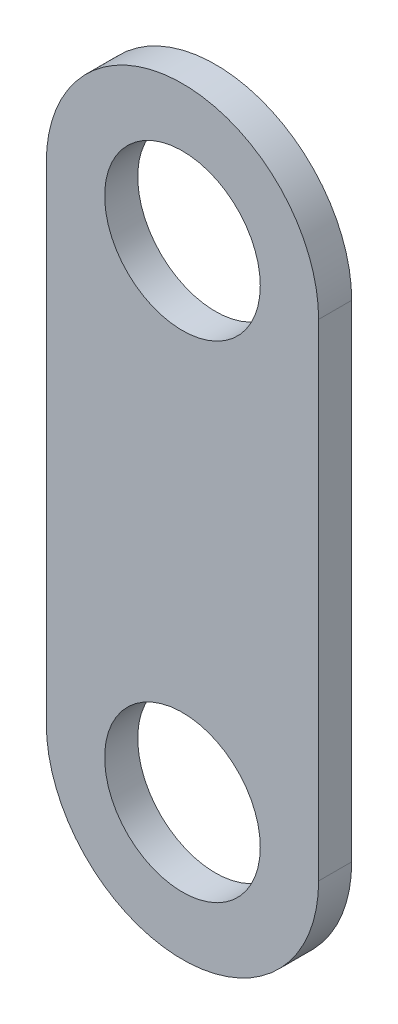
ISO-10303-21;
HEADER;
FILE_DESCRIPTION(('STEP AP214'),'2;1');
FILE_NAME('part.step','',(''),(''),'','','');
FILE_SCHEMA(('AUTOMOTIVE_DESIGN { 1 0 10303 214 1 1 1 1 }'));
ENDSEC;
DATA;
#1=APPLICATION_CONTEXT('core data for automotive mechanical design processes');
#2=APPLICATION_PROTOCOL_DEFINITION('international standard','automotive_design',2000,#1);
#3=PRODUCT_CONTEXT('',#1,'mechanical');
#4=PRODUCT('Part','Part','',(#3));
#5=PRODUCT_RELATED_PRODUCT_CATEGORY('part','',(#4));
#6=PRODUCT_DEFINITION_FORMATION('','',#4);
#7=PRODUCT_DEFINITION_CONTEXT('part definition',#1,'design');
#8=PRODUCT_DEFINITION('design','',#6,#7);
#9=PRODUCT_DEFINITION_SHAPE('','',#8);
#10=(LENGTH_UNIT() NAMED_UNIT(*) SI_UNIT(.MILLI.,.METRE.));
#11=(NAMED_UNIT(*) PLANE_ANGLE_UNIT() SI_UNIT($,.RADIAN.));
#12=(NAMED_UNIT(*) SI_UNIT($,.STERADIAN.) SOLID_ANGLE_UNIT());
#13=UNCERTAINTY_MEASURE_WITH_UNIT(LENGTH_MEASURE(1.E-05),#10,'distance_accuracy_value','');
#14=(GEOMETRIC_REPRESENTATION_CONTEXT(3) GLOBAL_UNCERTAINTY_ASSIGNED_CONTEXT((#13)) GLOBAL_UNIT_ASSIGNED_CONTEXT((#10,
#11,#12)) REPRESENTATION_CONTEXT('',''));
#15=CARTESIAN_POINT('',(0.,0.,0.));
#16=DIRECTION('',(0.,0.,1.));
#17=DIRECTION('',(1.,0.,0.));
#18=AXIS2_PLACEMENT_3D('',#15,#16,#17);
#19=CARTESIAN_POINT('',(7.,0.,1.7));
#20=DIRECTION('',(1.,0.,0.));
#21=DIRECTION('',(0.,0.,-1.));
#22=AXIS2_PLACEMENT_3D('',#19,#20,#21);
#23=PLANE('',#22);
#24=DIRECTION('',(0.,-1.,0.));
#25=VECTOR('',#24,1.);
#26=CARTESIAN_POINT('',(7.,0.,0.));
#27=LINE('',#26,#25);
#28=CARTESIAN_POINT('',(7.,25.,0.));
#29=VERTEX_POINT('',#28);
#30=CARTESIAN_POINT('',(7.,0.,0.));
#31=VERTEX_POINT('',#30);
#32=EDGE_CURVE('E121',#29,#31,#27,.T.);
#33=ORIENTED_EDGE('',*,*,#32,.F.);
#34=DIRECTION('',(0.,0.,-1.));
#35=VECTOR('',#34,1.);
#36=CARTESIAN_POINT('',(7.,25.,1.7));
#37=LINE('',#36,#35);
#38=CARTESIAN_POINT('',(7.,25.,1.7));
#39=VERTEX_POINT('',#38);
#40=EDGE_CURVE('E11',#39,#29,#37,.T.);
#41=ORIENTED_EDGE('',*,*,#40,.F.);
#42=DIRECTION('',(0.,-1.,0.));
#43=VECTOR('',#42,1.);
#44=CARTESIAN_POINT('',(7.,0.,1.7));
#45=LINE('',#44,#43);
#46=CARTESIAN_POINT('',(7.,0.,1.7));
#47=VERTEX_POINT('',#46);
#48=EDGE_CURVE('E100',#39,#47,#45,.T.);
#49=ORIENTED_EDGE('',*,*,#48,.T.);
#50=DIRECTION('',(0.,0.,-1.));
#51=VECTOR('',#50,1.);
#52=CARTESIAN_POINT('',(7.,0.,1.7));
#53=LINE('',#52,#51);
#54=EDGE_CURVE('E81',#47,#31,#53,.T.);
#55=ORIENTED_EDGE('',*,*,#54,.T.);
#56=EDGE_LOOP('',(#33,#41,#49,#55));
#57=FACE_BOUND('',#56,.T.);
#58=ADVANCED_FACE('F41',(#57),#23,.T.);
#59=CARTESIAN_POINT('',(0.,25.,1.7));
#60=DIRECTION('',(0.,0.,-1.));
#61=DIRECTION('',(-1.,0.,0.));
#62=AXIS2_PLACEMENT_3D('',#59,#60,#61);
#63=CYLINDRICAL_SURFACE('',#62,7.);
#64=CARTESIAN_POINT('',(0.,25.,0.));
#65=DIRECTION('',(0.,0.,1.));
#66=DIRECTION('',(1.,0.,0.));
#67=AXIS2_PLACEMENT_3D('',#64,#65,#66);
#68=CIRCLE('',#67,7.);
#69=CARTESIAN_POINT('',(-7.,25.,0.));
#70=VERTEX_POINT('',#69);
#71=EDGE_CURVE('E106',#29,#70,#68,.T.);
#72=ORIENTED_EDGE('',*,*,#71,.T.);
#73=DIRECTION('',(0.,0.,-1.));
#74=VECTOR('',#73,1.);
#75=CARTESIAN_POINT('',(-7.,25.,1.7));
#76=LINE('',#75,#74);
#77=CARTESIAN_POINT('',(-7.,25.,1.7));
#78=VERTEX_POINT('',#77);
#79=EDGE_CURVE('E51',#78,#70,#76,.T.);
#80=ORIENTED_EDGE('',*,*,#79,.F.);
#81=CARTESIAN_POINT('',(0.,25.,1.7));
#82=DIRECTION('',(0.,0.,1.));
#83=DIRECTION('',(1.,0.,0.));
#84=AXIS2_PLACEMENT_3D('',#81,#82,#83);
#85=CIRCLE('',#84,7.);
#86=EDGE_CURVE('E97',#39,#78,#85,.T.);
#87=ORIENTED_EDGE('',*,*,#86,.F.);
#88=ORIENTED_EDGE('',*,*,#40,.T.);
#89=EDGE_LOOP('',(#72,#80,#87,#88));
#90=FACE_BOUND('',#89,.T.);
#91=ADVANCED_FACE('F104',(#90),#63,.T.);
#92=CARTESIAN_POINT('',(-7.,0.,1.7));
#93=DIRECTION('',(1.,0.,0.));
#94=DIRECTION('',(0.,0.,-1.));
#95=AXIS2_PLACEMENT_3D('',#92,#93,#94);
#96=PLANE('',#95);
#97=DIRECTION('',(0.,-1.,0.));
#98=VECTOR('',#97,1.);
#99=CARTESIAN_POINT('',(-7.,0.,0.));
#100=LINE('',#99,#98);
#101=CARTESIAN_POINT('',(-7.,0.,0.));
#102=VERTEX_POINT('',#101);
#103=EDGE_CURVE('E116',#70,#102,#100,.T.);
#104=ORIENTED_EDGE('',*,*,#103,.T.);
#105=DIRECTION('',(0.,0.,-1.));
#106=VECTOR('',#105,1.);
#107=CARTESIAN_POINT('',(-7.,0.,1.7));
#108=LINE('',#107,#106);
#109=CARTESIAN_POINT('',(-7.,0.,1.7));
#110=VERTEX_POINT('',#109);
#111=EDGE_CURVE('E95',#110,#102,#108,.T.);
#112=ORIENTED_EDGE('',*,*,#111,.F.);
#113=DIRECTION('',(0.,-1.,0.));
#114=VECTOR('',#113,1.);
#115=CARTESIAN_POINT('',(-7.,0.,1.7));
#116=LINE('',#115,#114);
#117=EDGE_CURVE('E89',#78,#110,#116,.T.);
#118=ORIENTED_EDGE('',*,*,#117,.F.);
#119=ORIENTED_EDGE('',*,*,#79,.T.);
#120=EDGE_LOOP('',(#104,#112,#118,#119));
#121=FACE_BOUND('',#120,.T.);
#122=ADVANCED_FACE('F92',(#121),#96,.F.);
#123=CARTESIAN_POINT('',(0.,0.,1.7));
#124=DIRECTION('',(0.,0.,-1.));
#125=DIRECTION('',(-1.,0.,0.));
#126=AXIS2_PLACEMENT_3D('',#123,#124,#125);
#127=CYLINDRICAL_SURFACE('',#126,4.);
#128=CARTESIAN_POINT('',(0.,0.,1.7));
#129=DIRECTION('',(0.,0.,1.));
#130=DIRECTION('',(1.,0.,0.));
#131=AXIS2_PLACEMENT_3D('',#128,#129,#130);
#132=CIRCLE('',#131,4.);
#133=CARTESIAN_POINT('',(4.,0.,1.7));
#134=VERTEX_POINT('',#133);
#135=EDGE_CURVE('E136',#134,#134,#132,.T.);
#136=ORIENTED_EDGE('',*,*,#135,.T.);
#137=EDGE_LOOP('',(#136));
#138=FACE_BOUND('',#137,.T.);
#139=CARTESIAN_POINT('',(0.,0.,0.));
#140=DIRECTION('',(0.,0.,1.));
#141=DIRECTION('',(1.,0.,0.));
#142=AXIS2_PLACEMENT_3D('',#139,#140,#141);
#143=CIRCLE('',#142,4.);
#144=CARTESIAN_POINT('',(4.,0.,0.));
#145=VERTEX_POINT('',#144);
#146=EDGE_CURVE('E124',#145,#145,#143,.T.);
#147=ORIENTED_EDGE('',*,*,#146,.F.);
#148=EDGE_LOOP('',(#147));
#149=FACE_BOUND('',#148,.T.);
#150=ADVANCED_FACE('F149',(#138,#149),#127,.F.);
#151=CARTESIAN_POINT('',(0.,25.,1.7));
#152=DIRECTION('',(0.,0.,-1.));
#153=DIRECTION('',(-1.,0.,0.));
#154=AXIS2_PLACEMENT_3D('',#151,#152,#153);
#155=CYLINDRICAL_SURFACE('',#154,4.);
#156=CARTESIAN_POINT('',(0.,25.,1.7));
#157=DIRECTION('',(0.,0.,1.));
#158=DIRECTION('',(1.,0.,0.));
#159=AXIS2_PLACEMENT_3D('',#156,#157,#158);
#160=CIRCLE('',#159,4.);
#161=CARTESIAN_POINT('',(4.,25.,1.7));
#162=VERTEX_POINT('',#161);
#163=EDGE_CURVE('E115',#162,#162,#160,.F.);
#164=ORIENTED_EDGE('',*,*,#163,.F.);
#165=EDGE_LOOP('',(#164));
#166=FACE_BOUND('',#165,.T.);
#167=CARTESIAN_POINT('',(0.,25.,0.));
#168=DIRECTION('',(0.,0.,1.));
#169=DIRECTION('',(1.,0.,0.));
#170=AXIS2_PLACEMENT_3D('',#167,#168,#169);
#171=CIRCLE('',#170,4.);
#172=CARTESIAN_POINT('',(4.,25.,0.));
#173=VERTEX_POINT('',#172);
#174=EDGE_CURVE('E128',#173,#173,#171,.F.);
#175=ORIENTED_EDGE('',*,*,#174,.T.);
#176=EDGE_LOOP('',(#175));
#177=FACE_BOUND('',#176,.T.);
#178=ADVANCED_FACE('F43',(#166,#177),#155,.F.);
#179=CARTESIAN_POINT('',(0.,0.,1.7));
#180=DIRECTION('',(0.,0.,-1.));
#181=DIRECTION('',(-1.,0.,0.));
#182=AXIS2_PLACEMENT_3D('',#179,#180,#181);
#183=CYLINDRICAL_SURFACE('',#182,7.);
#184=CARTESIAN_POINT('',(0.,0.,0.));
#185=DIRECTION('',(0.,0.,1.));
#186=DIRECTION('',(1.,0.,0.));
#187=AXIS2_PLACEMENT_3D('',#184,#185,#186);
#188=CIRCLE('',#187,7.);
#189=EDGE_CURVE('E74',#102,#31,#188,.T.);
#190=ORIENTED_EDGE('',*,*,#189,.T.);
#191=ORIENTED_EDGE('',*,*,#54,.F.);
#192=CARTESIAN_POINT('',(0.,0.,1.7));
#193=DIRECTION('',(0.,0.,1.));
#194=DIRECTION('',(1.,0.,0.));
#195=AXIS2_PLACEMENT_3D('',#192,#193,#194);
#196=CIRCLE('',#195,7.);
#197=EDGE_CURVE('E59',#110,#47,#196,.T.);
#198=ORIENTED_EDGE('',*,*,#197,.F.);
#199=ORIENTED_EDGE('',*,*,#111,.T.);
#200=EDGE_LOOP('',(#190,#191,#198,#199));
#201=FACE_BOUND('',#200,.T.);
#202=ADVANCED_FACE('F148',(#201),#183,.T.);
#203=CARTESIAN_POINT('',(0.,0.,1.7));
#204=DIRECTION('',(0.,0.,1.));
#205=DIRECTION('',(1.,0.,0.));
#206=AXIS2_PLACEMENT_3D('',#203,#204,#205);
#207=PLANE('',#206);
#208=ORIENTED_EDGE('',*,*,#163,.T.);
#209=EDGE_LOOP('',(#208));
#210=FACE_BOUND('',#209,.T.);
#211=ORIENTED_EDGE('',*,*,#135,.F.);
#212=EDGE_LOOP('',(#211));
#213=FACE_BOUND('',#212,.T.);
#214=ORIENTED_EDGE('',*,*,#48,.F.);
#215=ORIENTED_EDGE('',*,*,#86,.T.);
#216=ORIENTED_EDGE('',*,*,#117,.T.);
#217=ORIENTED_EDGE('',*,*,#197,.T.);
#218=EDGE_LOOP('',(#214,#215,#216,#217));
#219=FACE_BOUND('',#218,.T.);
#220=ADVANCED_FACE('F99',(#210,#213,#219),#207,.T.);
#221=CARTESIAN_POINT('',(0.,0.,0.));
#222=DIRECTION('',(0.,0.,1.));
#223=DIRECTION('',(1.,0.,0.));
#224=AXIS2_PLACEMENT_3D('',#221,#222,#223);
#225=PLANE('',#224);
#226=ORIENTED_EDGE('',*,*,#174,.F.);
#227=EDGE_LOOP('',(#226));
#228=FACE_BOUND('',#227,.T.);
#229=ORIENTED_EDGE('',*,*,#146,.T.);
#230=EDGE_LOOP('',(#229));
#231=FACE_BOUND('',#230,.T.);
#232=ORIENTED_EDGE('',*,*,#32,.T.);
#233=ORIENTED_EDGE('',*,*,#189,.F.);
#234=ORIENTED_EDGE('',*,*,#103,.F.);
#235=ORIENTED_EDGE('',*,*,#71,.F.);
#236=EDGE_LOOP('',(#232,#233,#234,#235));
#237=FACE_BOUND('',#236,.T.);
#238=ADVANCED_FACE('F152',(#228,#231,#237),#225,.F.);
#239=CLOSED_SHELL('',(#58,#91,#122,#150,#178,#202,#220,#238));
#240=MANIFOLD_SOLID_BREP('B2',#239);
#241=ADVANCED_BREP_SHAPE_REPRESENTATION('',(#18,#240),#14);
#242=SHAPE_DEFINITION_REPRESENTATION(#9,#241);
ENDSEC;
END-ISO-10303-21;
